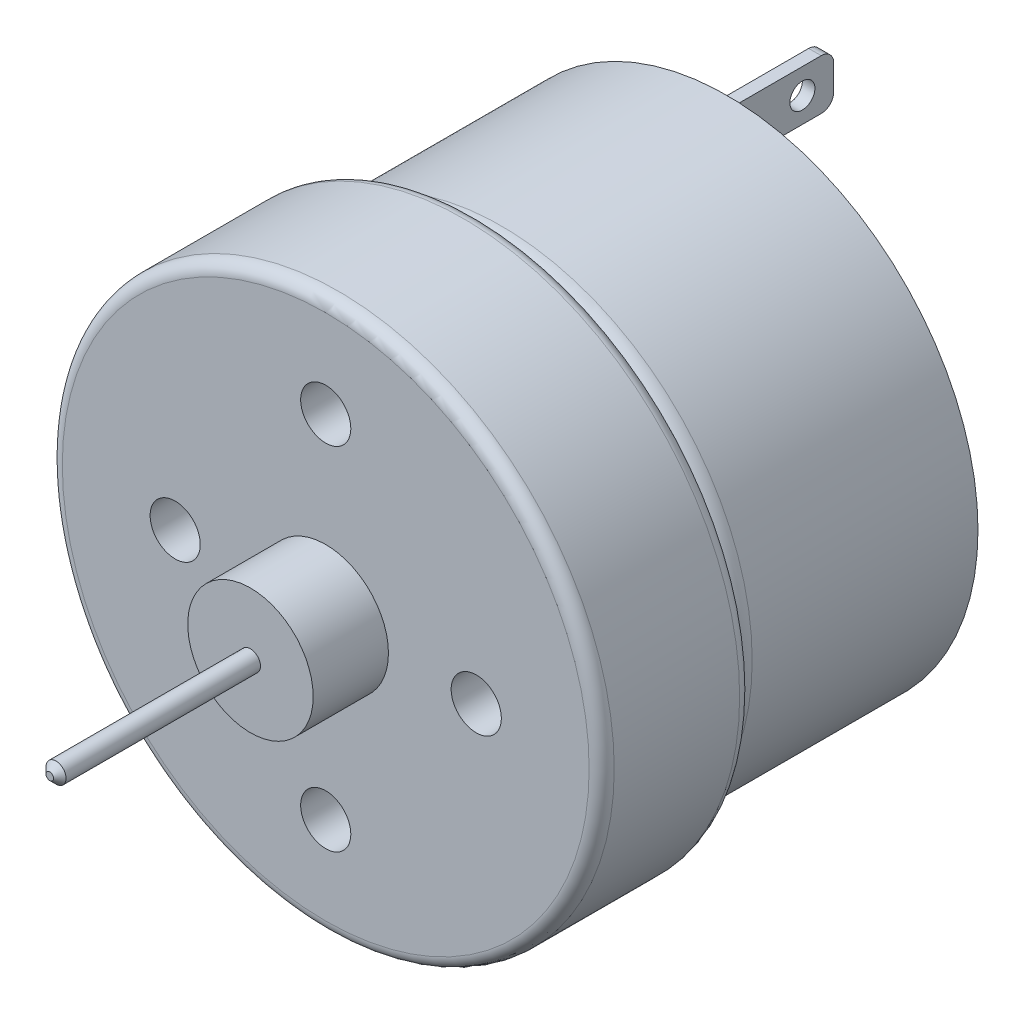
ISO-10303-21;
HEADER;
FILE_DESCRIPTION(('STEP AP214'),'2;1');
FILE_NAME('part.step','',(''),(''),'','','');
FILE_SCHEMA(('AUTOMOTIVE_DESIGN { 1 0 10303 214 1 1 1 1 }'));
ENDSEC;
DATA;
#1=APPLICATION_CONTEXT('core data for automotive mechanical design processes');
#2=APPLICATION_PROTOCOL_DEFINITION('international standard','automotive_design',2000,#1);
#3=PRODUCT_CONTEXT('',#1,'mechanical');
#4=PRODUCT('Part','Part','',(#3));
#5=PRODUCT_RELATED_PRODUCT_CATEGORY('part','',(#4));
#6=PRODUCT_DEFINITION_FORMATION('','',#4);
#7=PRODUCT_DEFINITION_CONTEXT('part definition',#1,'design');
#8=PRODUCT_DEFINITION('design','',#6,#7);
#9=PRODUCT_DEFINITION_SHAPE('','',#8);
#10=(LENGTH_UNIT() NAMED_UNIT(*) SI_UNIT(.MILLI.,.METRE.));
#11=(NAMED_UNIT(*) PLANE_ANGLE_UNIT() SI_UNIT($,.RADIAN.));
#12=(NAMED_UNIT(*) SI_UNIT($,.STERADIAN.) SOLID_ANGLE_UNIT());
#13=UNCERTAINTY_MEASURE_WITH_UNIT(LENGTH_MEASURE(1.E-05),#10,'distance_accuracy_value','');
#14=(GEOMETRIC_REPRESENTATION_CONTEXT(3) GLOBAL_UNCERTAINTY_ASSIGNED_CONTEXT((#13)) GLOBAL_UNIT_ASSIGNED_CONTEXT((#10,
#11,#12)) REPRESENTATION_CONTEXT('',''));
#15=CARTESIAN_POINT('',(0.,0.,0.));
#16=DIRECTION('',(0.,0.,1.));
#17=DIRECTION('',(1.,0.,0.));
#18=AXIS2_PLACEMENT_3D('',#15,#16,#17);
#19=CARTESIAN_POINT('',(0.,0.,0.));
#20=DIRECTION('',(0.,0.,1.));
#21=DIRECTION('',(1.,0.,0.));
#22=AXIS2_PLACEMENT_3D('',#19,#20,#21);
#23=PLANE('',#22);
#24=CARTESIAN_POINT('',(0.,0.,0.));
#25=DIRECTION('',(0.,0.,1.));
#26=DIRECTION('',(1.,0.,0.));
#27=AXIS2_PLACEMENT_3D('',#24,#25,#26);
#28=CIRCLE('',#27,10.);
#29=CARTESIAN_POINT('',(10.,0.,0.));
#30=VERTEX_POINT('',#29);
#31=EDGE_CURVE('E193',#30,#30,#28,.T.);
#32=ORIENTED_EDGE('',*,*,#31,.F.);
#33=EDGE_LOOP('',(#32));
#34=FACE_BOUND('',#33,.T.);
#35=CARTESIAN_POINT('',(0.,0.,0.));
#36=DIRECTION('',(0.,0.,-1.));
#37=DIRECTION('',(-1.,0.,0.));
#38=AXIS2_PLACEMENT_3D('',#35,#36,#37);
#39=CIRCLE('',#38,3.25);
#40=CARTESIAN_POINT('',(-3.25,0.,0.));
#41=VERTEX_POINT('',#40);
#42=EDGE_CURVE('E199',#41,#41,#39,.T.);
#43=ORIENTED_EDGE('',*,*,#42,.F.);
#44=EDGE_LOOP('',(#43));
#45=FACE_BOUND('',#44,.T.);
#46=DIRECTION('',(0.,-1.,0.));
#47=VECTOR('',#46,1.);
#48=CARTESIAN_POINT('',(0.250000000000003,9.75,0.));
#49=LINE('',#48,#47);
#50=CARTESIAN_POINT('',(0.250000000000003,9.75,0.));
#51=VERTEX_POINT('',#50);
#52=CARTESIAN_POINT('',(0.250000000000002,7.75,0.));
#53=VERTEX_POINT('',#52);
#54=EDGE_CURVE('E177',#51,#53,#49,.T.);
#55=ORIENTED_EDGE('',*,*,#54,.F.);
#56=DIRECTION('',(-1.,0.,0.));
#57=VECTOR('',#56,1.);
#58=CARTESIAN_POINT('',(0.250000000000003,9.75,0.));
#59=LINE('',#58,#57);
#60=CARTESIAN_POINT('',(-0.249999999999997,9.75,0.));
#61=VERTEX_POINT('',#60);
#62=EDGE_CURVE('E172',#51,#61,#59,.T.);
#63=ORIENTED_EDGE('',*,*,#62,.T.);
#64=DIRECTION('',(0.,-1.,0.));
#65=VECTOR('',#64,1.);
#66=CARTESIAN_POINT('',(-0.249999999999997,9.75,0.));
#67=LINE('',#66,#65);
#68=CARTESIAN_POINT('',(-0.249999999999998,7.75,0.));
#69=VERTEX_POINT('',#68);
#70=EDGE_CURVE('E183',#61,#69,#67,.T.);
#71=ORIENTED_EDGE('',*,*,#70,.T.);
#72=DIRECTION('',(-1.,0.,0.));
#73=VECTOR('',#72,1.);
#74=CARTESIAN_POINT('',(0.250000000000002,7.75,0.));
#75=LINE('',#74,#73);
#76=EDGE_CURVE('E186',#53,#69,#75,.T.);
#77=ORIENTED_EDGE('',*,*,#76,.F.);
#78=EDGE_LOOP('',(#55,#63,#71,#77));
#79=FACE_BOUND('',#78,.T.);
#80=DIRECTION('',(-1.,0.,0.));
#81=VECTOR('',#80,1.);
#82=CARTESIAN_POINT('',(0.250000000000003,-9.75,0.));
#83=LINE('',#82,#81);
#84=CARTESIAN_POINT('',(0.250000000000003,-9.75,0.));
#85=VERTEX_POINT('',#84);
#86=CARTESIAN_POINT('',(-0.249999999999997,-9.75,0.));
#87=VERTEX_POINT('',#86);
#88=EDGE_CURVE('E132',#85,#87,#83,.T.);
#89=ORIENTED_EDGE('',*,*,#88,.F.);
#90=DIRECTION('',(0.,1.,0.));
#91=VECTOR('',#90,1.);
#92=CARTESIAN_POINT('',(0.250000000000003,-9.75,0.));
#93=LINE('',#92,#91);
#94=CARTESIAN_POINT('',(0.250000000000002,-7.75,0.));
#95=VERTEX_POINT('',#94);
#96=EDGE_CURVE('E140',#85,#95,#93,.T.);
#97=ORIENTED_EDGE('',*,*,#96,.T.);
#98=DIRECTION('',(-1.,0.,0.));
#99=VECTOR('',#98,1.);
#100=CARTESIAN_POINT('',(0.250000000000002,-7.75,0.));
#101=LINE('',#100,#99);
#102=CARTESIAN_POINT('',(-0.249999999999998,-7.75,0.));
#103=VERTEX_POINT('',#102);
#104=EDGE_CURVE('E146',#95,#103,#101,.T.);
#105=ORIENTED_EDGE('',*,*,#104,.T.);
#106=DIRECTION('',(0.,1.,0.));
#107=VECTOR('',#106,1.);
#108=CARTESIAN_POINT('',(-0.249999999999997,-9.75,0.));
#109=LINE('',#108,#107);
#110=EDGE_CURVE('E149',#87,#103,#109,.T.);
#111=ORIENTED_EDGE('',*,*,#110,.F.);
#112=EDGE_LOOP('',(#89,#97,#105,#111));
#113=FACE_BOUND('',#112,.T.);
#114=ADVANCED_FACE('F38',(#34,#45,#79,#113),#23,.F.);
#115=CARTESIAN_POINT('',(0.,0.,10.));
#116=DIRECTION('',(0.,0.,-1.));
#117=DIRECTION('',(-1.,0.,0.));
#118=AXIS2_PLACEMENT_3D('',#115,#116,#117);
#119=CYLINDRICAL_SURFACE('',#118,10.);
#120=CARTESIAN_POINT('',(0.,0.,9.));
#121=DIRECTION('',(0.,0.,1.));
#122=DIRECTION('',(1.,0.,0.));
#123=AXIS2_PLACEMENT_3D('',#120,#121,#122);
#124=CIRCLE('',#123,10.);
#125=CARTESIAN_POINT('',(10.,0.,9.));
#126=VERTEX_POINT('',#125);
#127=EDGE_CURVE('E203',#126,#126,#124,.F.);
#128=ORIENTED_EDGE('',*,*,#127,.T.);
#129=EDGE_LOOP('',(#128));
#130=FACE_BOUND('',#129,.T.);
#131=ORIENTED_EDGE('',*,*,#31,.T.);
#132=EDGE_LOOP('',(#131));
#133=FACE_BOUND('',#132,.T.);
#134=ADVANCED_FACE('F281',(#130,#133),#119,.T.);
#135=CARTESIAN_POINT('',(0.,0.,9.));
#136=DIRECTION('',(0.,0.,1.));
#137=DIRECTION('',(1.,0.,0.));
#138=AXIS2_PLACEMENT_3D('',#135,#136,#137);
#139=TOROIDAL_SURFACE('',#138,9.,1.);
#140=ORIENTED_EDGE('',*,*,#127,.F.);
#141=EDGE_LOOP('',(#140));
#142=FACE_BOUND('',#141,.T.);
#143=CARTESIAN_POINT('',(0.,0.,10.));
#144=DIRECTION('',(0.,0.,1.));
#145=DIRECTION('',(1.,0.,0.));
#146=AXIS2_PLACEMENT_3D('',#143,#144,#145);
#147=CIRCLE('',#146,9.);
#148=CARTESIAN_POINT('',(9.,0.,10.));
#149=VERTEX_POINT('',#148);
#150=EDGE_CURVE('E206',#149,#149,#147,.T.);
#151=ORIENTED_EDGE('',*,*,#150,.F.);
#152=EDGE_LOOP('',(#151));
#153=FACE_BOUND('',#152,.T.);
#154=ADVANCED_FACE('F287',(#142,#153),#139,.T.);
#155=CARTESIAN_POINT('',(0.,0.,-2.));
#156=DIRECTION('',(0.,0.,1.));
#157=DIRECTION('',(1.,0.,0.));
#158=AXIS2_PLACEMENT_3D('',#155,#156,#157);
#159=CYLINDRICAL_SURFACE('',#158,3.25);
#160=CARTESIAN_POINT('',(0.,0.,-1.5));
#161=DIRECTION('',(0.,0.,-1.));
#162=DIRECTION('',(-1.,0.,0.));
#163=AXIS2_PLACEMENT_3D('',#160,#161,#162);
#164=CIRCLE('',#163,3.25);
#165=CARTESIAN_POINT('',(-3.25,0.,-1.5));
#166=VERTEX_POINT('',#165);
#167=EDGE_CURVE('E260',#166,#166,#164,.F.);
#168=ORIENTED_EDGE('',*,*,#167,.T.);
#169=EDGE_LOOP('',(#168));
#170=FACE_BOUND('',#169,.T.);
#171=ORIENTED_EDGE('',*,*,#42,.T.);
#172=EDGE_LOOP('',(#171));
#173=FACE_BOUND('',#172,.T.);
#174=ADVANCED_FACE('F293',(#170,#173),#159,.T.);
#175=CARTESIAN_POINT('',(0.,0.,-2.));
#176=DIRECTION('',(0.,0.,-1.));
#177=DIRECTION('',(-1.,0.,0.));
#178=AXIS2_PLACEMENT_3D('',#175,#176,#177);
#179=PLANE('',#178);
#180=CARTESIAN_POINT('',(0.,0.,-2.));
#181=DIRECTION('',(0.,0.,-1.));
#182=DIRECTION('',(-1.,0.,0.));
#183=AXIS2_PLACEMENT_3D('',#180,#181,#182);
#184=CIRCLE('',#183,2.75);
#185=CARTESIAN_POINT('',(-2.75,0.,-2.));
#186=VERTEX_POINT('',#185);
#187=EDGE_CURVE('E257',#186,#186,#184,.T.);
#188=ORIENTED_EDGE('',*,*,#187,.T.);
#189=EDGE_LOOP('',(#188));
#190=FACE_BOUND('',#189,.T.);
#191=ADVANCED_FACE('F388',(#190),#179,.T.);
#192=CARTESIAN_POINT('',(0.250000000000003,9.75,-4.));
#193=DIRECTION('',(0.,1.,0.));
#194=DIRECTION('',(0.,0.,1.));
#195=AXIS2_PLACEMENT_3D('',#192,#193,#194);
#196=PLANE('',#195);
#197=DIRECTION('',(0.,0.,1.));
#198=VECTOR('',#197,1.);
#199=CARTESIAN_POINT('',(0.250000000000003,9.75,-4.));
#200=LINE('',#199,#198);
#201=CARTESIAN_POINT('',(0.250000000000003,9.75,-3.5));
#202=VERTEX_POINT('',#201);
#203=EDGE_CURVE('E191',#202,#51,#200,.T.);
#204=ORIENTED_EDGE('',*,*,#203,.F.);
#205=DIRECTION('',(-1.,0.,0.));
#206=VECTOR('',#205,1.);
#207=CARTESIAN_POINT('',(-0.249999999999997,9.75,-3.5));
#208=LINE('',#207,#206);
#209=CARTESIAN_POINT('',(-0.249999999999997,9.75,-3.5));
#210=VERTEX_POINT('',#209);
#211=EDGE_CURVE('E225',#202,#210,#208,.T.);
#212=ORIENTED_EDGE('',*,*,#211,.T.);
#213=DIRECTION('',(0.,0.,1.));
#214=VECTOR('',#213,1.);
#215=CARTESIAN_POINT('',(-0.249999999999997,9.75,-4.));
#216=LINE('',#215,#214);
#217=EDGE_CURVE('E180',#210,#61,#216,.T.);
#218=ORIENTED_EDGE('',*,*,#217,.T.);
#219=ORIENTED_EDGE('',*,*,#62,.F.);
#220=EDGE_LOOP('',(#204,#212,#218,#219));
#221=FACE_BOUND('',#220,.T.);
#222=ADVANCED_FACE('F379',(#221),#196,.T.);
#223=CARTESIAN_POINT('',(0.250000000000003,9.75,-4.));
#224=DIRECTION('',(-1.,0.,0.));
#225=DIRECTION('',(0.,-1.,0.));
#226=AXIS2_PLACEMENT_3D('',#223,#224,#225);
#227=PLANE('',#226);
#228=CARTESIAN_POINT('',(0.250000000000002,8.75,-2.75));
#229=DIRECTION('',(-1.,0.,0.));
#230=DIRECTION('',(0.,-1.,0.));
#231=AXIS2_PLACEMENT_3D('',#228,#229,#230);
#232=CIRCLE('',#231,0.5);
#233=CARTESIAN_POINT('',(0.250000000000002,8.25,-2.75));
#234=VERTEX_POINT('',#233);
#235=EDGE_CURVE('E169',#234,#234,#232,.T.);
#236=ORIENTED_EDGE('',*,*,#235,.T.);
#237=EDGE_LOOP('',(#236));
#238=FACE_BOUND('',#237,.T.);
#239=DIRECTION('',(0.,0.,1.));
#240=VECTOR('',#239,1.);
#241=CARTESIAN_POINT('',(0.250000000000002,7.75,-4.));
#242=LINE('',#241,#240);
#243=CARTESIAN_POINT('',(0.250000000000002,7.75,-3.5));
#244=VERTEX_POINT('',#243);
#245=EDGE_CURVE('E194',#244,#53,#242,.T.);
#246=ORIENTED_EDGE('',*,*,#245,.F.);
#247=CARTESIAN_POINT('',(0.250000000000002,8.25,-3.5));
#248=DIRECTION('',(-1.,0.,0.));
#249=DIRECTION('',(0.,-1.,0.));
#250=AXIS2_PLACEMENT_3D('',#247,#248,#249);
#251=CIRCLE('',#250,0.5);
#252=CARTESIAN_POINT('',(0.250000000000002,8.25,-4.));
#253=VERTEX_POINT('',#252);
#254=EDGE_CURVE('E223',#244,#253,#251,.F.);
#255=ORIENTED_EDGE('',*,*,#254,.T.);
#256=DIRECTION('',(0.,-1.,0.));
#257=VECTOR('',#256,1.);
#258=CARTESIAN_POINT('',(0.250000000000003,9.75,-4.));
#259=LINE('',#258,#257);
#260=CARTESIAN_POINT('',(0.250000000000002,9.25,-4.));
#261=VERTEX_POINT('',#260);
#262=EDGE_CURVE('E176',#261,#253,#259,.T.);
#263=ORIENTED_EDGE('',*,*,#262,.F.);
#264=CARTESIAN_POINT('',(0.250000000000002,9.25,-3.5));
#265=DIRECTION('',(-1.,0.,0.));
#266=DIRECTION('',(0.,-1.,0.));
#267=AXIS2_PLACEMENT_3D('',#264,#265,#266);
#268=CIRCLE('',#267,0.5);
#269=EDGE_CURVE('E221',#261,#202,#268,.F.);
#270=ORIENTED_EDGE('',*,*,#269,.T.);
#271=ORIENTED_EDGE('',*,*,#203,.T.);
#272=ORIENTED_EDGE('',*,*,#54,.T.);
#273=EDGE_LOOP('',(#246,#255,#263,#270,#271,#272));
#274=FACE_BOUND('',#273,.T.);
#275=ADVANCED_FACE('F375',(#238,#274),#227,.F.);
#276=CARTESIAN_POINT('',(0.250000000000002,7.75,-4.));
#277=DIRECTION('',(0.,1.,0.));
#278=DIRECTION('',(0.,0.,1.));
#279=AXIS2_PLACEMENT_3D('',#276,#277,#278);
#280=PLANE('',#279);
#281=DIRECTION('',(0.,0.,1.));
#282=VECTOR('',#281,1.);
#283=CARTESIAN_POINT('',(-0.249999999999998,7.75,-4.));
#284=LINE('',#283,#282);
#285=CARTESIAN_POINT('',(-0.249999999999998,7.75,-3.5));
#286=VERTEX_POINT('',#285);
#287=EDGE_CURVE('E196',#286,#69,#284,.T.);
#288=ORIENTED_EDGE('',*,*,#287,.F.);
#289=DIRECTION('',(-1.,0.,0.));
#290=VECTOR('',#289,1.);
#291=CARTESIAN_POINT('',(0.250000000000002,7.75,-3.5));
#292=LINE('',#291,#290);
#293=EDGE_CURVE('E219',#286,#244,#292,.F.);
#294=ORIENTED_EDGE('',*,*,#293,.T.);
#295=ORIENTED_EDGE('',*,*,#245,.T.);
#296=ORIENTED_EDGE('',*,*,#76,.T.);
#297=EDGE_LOOP('',(#288,#294,#295,#296));
#298=FACE_BOUND('',#297,.T.);
#299=ADVANCED_FACE('F378',(#298),#280,.F.);
#300=CARTESIAN_POINT('',(-0.249999999999997,9.75,-4.));
#301=DIRECTION('',(-1.,0.,0.));
#302=DIRECTION('',(0.,-1.,0.));
#303=AXIS2_PLACEMENT_3D('',#300,#301,#302);
#304=PLANE('',#303);
#305=CARTESIAN_POINT('',(-0.249999999999998,8.75,-2.75));
#306=DIRECTION('',(-1.,0.,0.));
#307=DIRECTION('',(0.,-1.,0.));
#308=AXIS2_PLACEMENT_3D('',#305,#306,#307);
#309=CIRCLE('',#308,0.5);
#310=CARTESIAN_POINT('',(-0.249999999999998,8.25,-2.75));
#311=VERTEX_POINT('',#310);
#312=EDGE_CURVE('E163',#311,#311,#309,.T.);
#313=ORIENTED_EDGE('',*,*,#312,.F.);
#314=EDGE_LOOP('',(#313));
#315=FACE_BOUND('',#314,.T.);
#316=DIRECTION('',(0.,-1.,0.));
#317=VECTOR('',#316,1.);
#318=CARTESIAN_POINT('',(-0.249999999999997,9.75,-4.));
#319=LINE('',#318,#317);
#320=CARTESIAN_POINT('',(-0.249999999999998,9.25,-4.));
#321=VERTEX_POINT('',#320);
#322=CARTESIAN_POINT('',(-0.249999999999998,8.25,-4.));
#323=VERTEX_POINT('',#322);
#324=EDGE_CURVE('E173',#321,#323,#319,.T.);
#325=ORIENTED_EDGE('',*,*,#324,.T.);
#326=CARTESIAN_POINT('',(-0.249999999999998,8.25,-3.5));
#327=DIRECTION('',(-1.,0.,0.));
#328=DIRECTION('',(0.,-1.,0.));
#329=AXIS2_PLACEMENT_3D('',#326,#327,#328);
#330=CIRCLE('',#329,0.5);
#331=EDGE_CURVE('E217',#323,#286,#330,.T.);
#332=ORIENTED_EDGE('',*,*,#331,.T.);
#333=ORIENTED_EDGE('',*,*,#287,.T.);
#334=ORIENTED_EDGE('',*,*,#70,.F.);
#335=ORIENTED_EDGE('',*,*,#217,.F.);
#336=CARTESIAN_POINT('',(-0.249999999999998,9.25,-3.5));
#337=DIRECTION('',(-1.,0.,0.));
#338=DIRECTION('',(0.,-1.,0.));
#339=AXIS2_PLACEMENT_3D('',#336,#337,#338);
#340=CIRCLE('',#339,0.5);
#341=EDGE_CURVE('E215',#210,#321,#340,.T.);
#342=ORIENTED_EDGE('',*,*,#341,.T.);
#343=EDGE_LOOP('',(#325,#332,#333,#334,#335,#342));
#344=FACE_BOUND('',#343,.T.);
#345=ADVANCED_FACE('F373',(#315,#344),#304,.T.);
#346=CARTESIAN_POINT('',(0.,0.,-4.));
#347=DIRECTION('',(0.,0.,1.));
#348=DIRECTION('',(1.,0.,0.));
#349=AXIS2_PLACEMENT_3D('',#346,#347,#348);
#350=PLANE('',#349);
#351=ORIENTED_EDGE('',*,*,#262,.T.);
#352=DIRECTION('',(-1.,0.,0.));
#353=VECTOR('',#352,1.);
#354=CARTESIAN_POINT('',(0.,8.25,-4.));
#355=LINE('',#354,#353);
#356=EDGE_CURVE('E212',#253,#323,#355,.T.);
#357=ORIENTED_EDGE('',*,*,#356,.T.);
#358=ORIENTED_EDGE('',*,*,#324,.F.);
#359=DIRECTION('',(-1.,0.,0.));
#360=VECTOR('',#359,1.);
#361=CARTESIAN_POINT('',(0.250000000000003,9.25,-4.));
#362=LINE('',#361,#360);
#363=EDGE_CURVE('E202',#321,#261,#362,.F.);
#364=ORIENTED_EDGE('',*,*,#363,.T.);
#365=EDGE_LOOP('',(#351,#357,#358,#364));
#366=FACE_BOUND('',#365,.T.);
#367=ADVANCED_FACE('F369',(#366),#350,.F.);
#368=CARTESIAN_POINT('',(3.75,8.75,-2.75));
#369=DIRECTION('',(-1.,0.,0.));
#370=DIRECTION('',(0.,-1.,0.));
#371=AXIS2_PLACEMENT_3D('',#368,#369,#370);
#372=CYLINDRICAL_SURFACE('',#371,0.5);
#373=ORIENTED_EDGE('',*,*,#312,.T.);
#374=EDGE_LOOP('',(#373));
#375=FACE_BOUND('',#374,.T.);
#376=ORIENTED_EDGE('',*,*,#235,.F.);
#377=EDGE_LOOP('',(#376));
#378=FACE_BOUND('',#377,.T.);
#379=ADVANCED_FACE('F303',(#375,#378),#372,.F.);
#380=CARTESIAN_POINT('',(0.,8.25,-3.5));
#381=DIRECTION('',(-1.,0.,0.));
#382=DIRECTION('',(0.,0.,1.));
#383=AXIS2_PLACEMENT_3D('',#380,#381,#382);
#384=CYLINDRICAL_SURFACE('',#383,0.5);
#385=ORIENTED_EDGE('',*,*,#254,.F.);
#386=ORIENTED_EDGE('',*,*,#293,.F.);
#387=ORIENTED_EDGE('',*,*,#331,.F.);
#388=ORIENTED_EDGE('',*,*,#356,.F.);
#389=EDGE_LOOP('',(#385,#386,#387,#388));
#390=FACE_BOUND('',#389,.T.);
#391=ADVANCED_FACE('F299',(#390),#384,.T.);
#392=CARTESIAN_POINT('',(0.250000000000003,9.25,-3.5));
#393=DIRECTION('',(1.,0.,0.));
#394=DIRECTION('',(0.,0.,-1.));
#395=AXIS2_PLACEMENT_3D('',#392,#393,#394);
#396=CYLINDRICAL_SURFACE('',#395,0.5);
#397=ORIENTED_EDGE('',*,*,#269,.F.);
#398=ORIENTED_EDGE('',*,*,#363,.F.);
#399=ORIENTED_EDGE('',*,*,#341,.F.);
#400=ORIENTED_EDGE('',*,*,#211,.F.);
#401=EDGE_LOOP('',(#397,#398,#399,#400));
#402=FACE_BOUND('',#401,.T.);
#403=ADVANCED_FACE('F302',(#402),#396,.T.);
#404=CARTESIAN_POINT('',(0.250000000000003,-9.75,-4.));
#405=DIRECTION('',(0.,1.,0.));
#406=DIRECTION('',(0.,0.,1.));
#407=AXIS2_PLACEMENT_3D('',#404,#405,#406);
#408=PLANE('',#407);
#409=DIRECTION('',(0.,0.,1.));
#410=VECTOR('',#409,1.);
#411=CARTESIAN_POINT('',(-0.249999999999997,-9.75,-4.));
#412=LINE('',#411,#410);
#413=CARTESIAN_POINT('',(-0.249999999999997,-9.75,-3.5));
#414=VERTEX_POINT('',#413);
#415=EDGE_CURVE('E161',#414,#87,#412,.T.);
#416=ORIENTED_EDGE('',*,*,#415,.F.);
#417=DIRECTION('',(-1.,0.,0.));
#418=VECTOR('',#417,1.);
#419=CARTESIAN_POINT('',(0.250000000000003,-9.75,-3.5));
#420=LINE('',#419,#418);
#421=CARTESIAN_POINT('',(0.250000000000003,-9.75,-3.5));
#422=VERTEX_POINT('',#421);
#423=EDGE_CURVE('E53',#414,#422,#420,.F.);
#424=ORIENTED_EDGE('',*,*,#423,.T.);
#425=DIRECTION('',(0.,0.,1.));
#426=VECTOR('',#425,1.);
#427=CARTESIAN_POINT('',(0.250000000000003,-9.75,-4.));
#428=LINE('',#427,#426);
#429=EDGE_CURVE('E128',#422,#85,#428,.T.);
#430=ORIENTED_EDGE('',*,*,#429,.T.);
#431=ORIENTED_EDGE('',*,*,#88,.T.);
#432=EDGE_LOOP('',(#416,#424,#430,#431));
#433=FACE_BOUND('',#432,.T.);
#434=ADVANCED_FACE('F130',(#433),#408,.F.);
#435=CARTESIAN_POINT('',(-0.249999999999997,-9.75,-4.));
#436=DIRECTION('',(1.,0.,0.));
#437=DIRECTION('',(0.,1.,0.));
#438=AXIS2_PLACEMENT_3D('',#435,#436,#437);
#439=PLANE('',#438);
#440=CARTESIAN_POINT('',(-0.249999999999998,-8.75,-2.75));
#441=DIRECTION('',(1.,0.,0.));
#442=DIRECTION('',(0.,1.,0.));
#443=AXIS2_PLACEMENT_3D('',#440,#441,#442);
#444=CIRCLE('',#443,0.5);
#445=CARTESIAN_POINT('',(-0.249999999999998,-8.25,-2.75));
#446=VERTEX_POINT('',#445);
#447=EDGE_CURVE('E153',#446,#446,#444,.T.);
#448=ORIENTED_EDGE('',*,*,#447,.T.);
#449=EDGE_LOOP('',(#448));
#450=FACE_BOUND('',#449,.T.);
#451=DIRECTION('',(0.,0.,1.));
#452=VECTOR('',#451,1.);
#453=CARTESIAN_POINT('',(-0.249999999999998,-7.75,-4.));
#454=LINE('',#453,#452);
#455=CARTESIAN_POINT('',(-0.249999999999998,-7.75,-3.5));
#456=VERTEX_POINT('',#455);
#457=EDGE_CURVE('E164',#456,#103,#454,.T.);
#458=ORIENTED_EDGE('',*,*,#457,.F.);
#459=CARTESIAN_POINT('',(-0.249999999999998,-8.25,-3.5));
#460=DIRECTION('',(1.,0.,0.));
#461=DIRECTION('',(0.,1.,0.));
#462=AXIS2_PLACEMENT_3D('',#459,#460,#461);
#463=CIRCLE('',#462,0.5);
#464=CARTESIAN_POINT('',(-0.249999999999998,-8.25,-4.));
#465=VERTEX_POINT('',#464);
#466=EDGE_CURVE('E233',#456,#465,#463,.F.);
#467=ORIENTED_EDGE('',*,*,#466,.T.);
#468=DIRECTION('',(0.,1.,0.));
#469=VECTOR('',#468,1.);
#470=CARTESIAN_POINT('',(-0.249999999999997,-9.75,-4.));
#471=LINE('',#470,#469);
#472=CARTESIAN_POINT('',(-0.249999999999998,-9.25,-4.));
#473=VERTEX_POINT('',#472);
#474=EDGE_CURVE('E137',#473,#465,#471,.T.);
#475=ORIENTED_EDGE('',*,*,#474,.F.);
#476=CARTESIAN_POINT('',(-0.249999999999998,-9.25,-3.5));
#477=DIRECTION('',(1.,0.,0.));
#478=DIRECTION('',(0.,1.,0.));
#479=AXIS2_PLACEMENT_3D('',#476,#477,#478);
#480=CIRCLE('',#479,0.5);
#481=EDGE_CURVE('E231',#473,#414,#480,.F.);
#482=ORIENTED_EDGE('',*,*,#481,.T.);
#483=ORIENTED_EDGE('',*,*,#415,.T.);
#484=ORIENTED_EDGE('',*,*,#110,.T.);
#485=EDGE_LOOP('',(#458,#467,#475,#482,#483,#484));
#486=FACE_BOUND('',#485,.T.);
#487=ADVANCED_FACE('F354',(#450,#486),#439,.F.);
#488=CARTESIAN_POINT('',(0.250000000000002,-7.75,-4.));
#489=DIRECTION('',(0.,1.,0.));
#490=DIRECTION('',(0.,0.,1.));
#491=AXIS2_PLACEMENT_3D('',#488,#489,#490);
#492=PLANE('',#491);
#493=DIRECTION('',(0.,0.,1.));
#494=VECTOR('',#493,1.);
#495=CARTESIAN_POINT('',(0.250000000000002,-7.75,-4.));
#496=LINE('',#495,#494);
#497=CARTESIAN_POINT('',(0.250000000000002,-7.75,-3.5));
#498=VERTEX_POINT('',#497);
#499=EDGE_CURVE('E136',#498,#95,#496,.T.);
#500=ORIENTED_EDGE('',*,*,#499,.F.);
#501=DIRECTION('',(-1.,0.,0.));
#502=VECTOR('',#501,1.);
#503=CARTESIAN_POINT('',(-0.249999999999998,-7.75,-3.5));
#504=LINE('',#503,#502);
#505=EDGE_CURVE('E227',#498,#456,#504,.T.);
#506=ORIENTED_EDGE('',*,*,#505,.T.);
#507=ORIENTED_EDGE('',*,*,#457,.T.);
#508=ORIENTED_EDGE('',*,*,#104,.F.);
#509=EDGE_LOOP('',(#500,#506,#507,#508));
#510=FACE_BOUND('',#509,.T.);
#511=ADVANCED_FACE('F357',(#510),#492,.T.);
#512=CARTESIAN_POINT('',(0.250000000000003,-9.75,-4.));
#513=DIRECTION('',(1.,0.,0.));
#514=DIRECTION('',(0.,1.,0.));
#515=AXIS2_PLACEMENT_3D('',#512,#513,#514);
#516=PLANE('',#515);
#517=CARTESIAN_POINT('',(0.250000000000002,-8.75,-2.75));
#518=DIRECTION('',(1.,0.,0.));
#519=DIRECTION('',(0.,1.,0.));
#520=AXIS2_PLACEMENT_3D('',#517,#518,#519);
#521=CIRCLE('',#520,0.5);
#522=CARTESIAN_POINT('',(0.250000000000002,-8.25,-2.75));
#523=VERTEX_POINT('',#522);
#524=EDGE_CURVE('E150',#523,#523,#521,.F.);
#525=ORIENTED_EDGE('',*,*,#524,.T.);
#526=EDGE_LOOP('',(#525));
#527=FACE_BOUND('',#526,.T.);
#528=DIRECTION('',(0.,1.,0.));
#529=VECTOR('',#528,1.);
#530=CARTESIAN_POINT('',(0.250000000000003,-9.75,-4.));
#531=LINE('',#530,#529);
#532=CARTESIAN_POINT('',(0.250000000000002,-9.25,-4.));
#533=VERTEX_POINT('',#532);
#534=CARTESIAN_POINT('',(0.250000000000002,-8.25,-4.));
#535=VERTEX_POINT('',#534);
#536=EDGE_CURVE('E160',#533,#535,#531,.T.);
#537=ORIENTED_EDGE('',*,*,#536,.T.);
#538=CARTESIAN_POINT('',(0.250000000000002,-8.25,-3.5));
#539=DIRECTION('',(1.,0.,0.));
#540=DIRECTION('',(0.,1.,0.));
#541=AXIS2_PLACEMENT_3D('',#538,#539,#540);
#542=CIRCLE('',#541,0.5);
#543=EDGE_CURVE('E241',#535,#498,#542,.T.);
#544=ORIENTED_EDGE('',*,*,#543,.T.);
#545=ORIENTED_EDGE('',*,*,#499,.T.);
#546=ORIENTED_EDGE('',*,*,#96,.F.);
#547=ORIENTED_EDGE('',*,*,#429,.F.);
#548=CARTESIAN_POINT('',(0.250000000000002,-9.25,-3.5));
#549=DIRECTION('',(1.,0.,0.));
#550=DIRECTION('',(0.,1.,0.));
#551=AXIS2_PLACEMENT_3D('',#548,#549,#550);
#552=CIRCLE('',#551,0.5);
#553=EDGE_CURVE('E239',#422,#533,#552,.T.);
#554=ORIENTED_EDGE('',*,*,#553,.T.);
#555=EDGE_LOOP('',(#537,#544,#545,#546,#547,#554));
#556=FACE_BOUND('',#555,.T.);
#557=ADVANCED_FACE('F141',(#527,#556),#516,.T.);
#558=CARTESIAN_POINT('',(0.,0.,-4.));
#559=DIRECTION('',(0.,0.,1.));
#560=DIRECTION('',(1.,0.,0.));
#561=AXIS2_PLACEMENT_3D('',#558,#559,#560);
#562=PLANE('',#561);
#563=ORIENTED_EDGE('',*,*,#474,.T.);
#564=DIRECTION('',(-1.,0.,0.));
#565=VECTOR('',#564,1.);
#566=CARTESIAN_POINT('',(0.250000000000002,-8.25,-4.));
#567=LINE('',#566,#565);
#568=EDGE_CURVE('E61',#465,#535,#567,.F.);
#569=ORIENTED_EDGE('',*,*,#568,.T.);
#570=ORIENTED_EDGE('',*,*,#536,.F.);
#571=DIRECTION('',(-1.,0.,0.));
#572=VECTOR('',#571,1.);
#573=CARTESIAN_POINT('',(0.,-9.25,-4.));
#574=LINE('',#573,#572);
#575=EDGE_CURVE('E235',#533,#473,#574,.T.);
#576=ORIENTED_EDGE('',*,*,#575,.T.);
#577=EDGE_LOOP('',(#563,#569,#570,#576));
#578=FACE_BOUND('',#577,.T.);
#579=ADVANCED_FACE('F350',(#578),#562,.F.);
#580=CARTESIAN_POINT('',(3.75,-8.75,-2.75));
#581=DIRECTION('',(-1.,0.,0.));
#582=DIRECTION('',(0.,-1.,0.));
#583=AXIS2_PLACEMENT_3D('',#580,#581,#582);
#584=CYLINDRICAL_SURFACE('',#583,0.5);
#585=ORIENTED_EDGE('',*,*,#524,.F.);
#586=EDGE_LOOP('',(#585));
#587=FACE_BOUND('',#586,.T.);
#588=ORIENTED_EDGE('',*,*,#447,.F.);
#589=EDGE_LOOP('',(#588));
#590=FACE_BOUND('',#589,.T.);
#591=ADVANCED_FACE('F312',(#587,#590),#584,.F.);
#592=CARTESIAN_POINT('',(0.250000000000002,-8.25,-3.5));
#593=DIRECTION('',(1.,0.,0.));
#594=DIRECTION('',(0.,0.,-1.));
#595=AXIS2_PLACEMENT_3D('',#592,#593,#594);
#596=CYLINDRICAL_SURFACE('',#595,0.5);
#597=ORIENTED_EDGE('',*,*,#543,.F.);
#598=ORIENTED_EDGE('',*,*,#568,.F.);
#599=ORIENTED_EDGE('',*,*,#466,.F.);
#600=ORIENTED_EDGE('',*,*,#505,.F.);
#601=EDGE_LOOP('',(#597,#598,#599,#600));
#602=FACE_BOUND('',#601,.T.);
#603=ADVANCED_FACE('F308',(#602),#596,.T.);
#604=CARTESIAN_POINT('',(0.,-9.25,-3.5));
#605=DIRECTION('',(-1.,0.,0.));
#606=DIRECTION('',(0.,0.,1.));
#607=AXIS2_PLACEMENT_3D('',#604,#605,#606);
#608=CYLINDRICAL_SURFACE('',#607,0.5);
#609=ORIENTED_EDGE('',*,*,#553,.F.);
#610=ORIENTED_EDGE('',*,*,#423,.F.);
#611=ORIENTED_EDGE('',*,*,#481,.F.);
#612=ORIENTED_EDGE('',*,*,#575,.F.);
#613=EDGE_LOOP('',(#609,#610,#611,#612));
#614=FACE_BOUND('',#613,.T.);
#615=ADVANCED_FACE('F311',(#614),#608,.T.);
#616=CARTESIAN_POINT('',(0.,0.,16.));
#617=DIRECTION('',(0.,0.,-1.));
#618=DIRECTION('',(-1.,0.,0.));
#619=AXIS2_PLACEMENT_3D('',#616,#617,#618);
#620=CYLINDRICAL_SURFACE('',#619,11.);
#621=CARTESIAN_POINT('',(0.,0.,15.5));
#622=DIRECTION('',(0.,0.,1.));
#623=DIRECTION('',(1.,0.,0.));
#624=AXIS2_PLACEMENT_3D('',#621,#622,#623);
#625=CIRCLE('',#624,11.);
#626=CARTESIAN_POINT('',(11.,0.,15.5));
#627=VERTEX_POINT('',#626);
#628=EDGE_CURVE('E250',#627,#627,#625,.F.);
#629=ORIENTED_EDGE('',*,*,#628,.T.);
#630=EDGE_LOOP('',(#629));
#631=FACE_BOUND('',#630,.T.);
#632=CARTESIAN_POINT('',(0.,0.,10.5));
#633=DIRECTION('',(0.,0.,1.));
#634=DIRECTION('',(1.,0.,0.));
#635=AXIS2_PLACEMENT_3D('',#632,#633,#634);
#636=CIRCLE('',#635,11.);
#637=CARTESIAN_POINT('',(11.,0.,10.5));
#638=VERTEX_POINT('',#637);
#639=EDGE_CURVE('E247',#638,#638,#636,.T.);
#640=ORIENTED_EDGE('',*,*,#639,.T.);
#641=EDGE_LOOP('',(#640));
#642=FACE_BOUND('',#641,.T.);
#643=ADVANCED_FACE('F316',(#631,#642),#620,.T.);
#644=CARTESIAN_POINT('',(0.,0.,16.));
#645=DIRECTION('',(0.,0.,1.));
#646=DIRECTION('',(1.,0.,0.));
#647=AXIS2_PLACEMENT_3D('',#644,#645,#646);
#648=PLANE('',#647);
#649=CARTESIAN_POINT('',(0.,7.,16.));
#650=DIRECTION('',(0.,0.,1.));
#651=DIRECTION('',(1.,0.,0.));
#652=AXIS2_PLACEMENT_3D('',#649,#650,#651);
#653=CIRCLE('',#652,1.);
#654=CARTESIAN_POINT('',(1.,7.,16.));
#655=VERTEX_POINT('',#654);
#656=EDGE_CURVE('E696',#655,#655,#653,.T.);
#657=ORIENTED_EDGE('',*,*,#656,.F.);
#658=EDGE_LOOP('',(#657));
#659=FACE_BOUND('',#658,.T.);
#660=CARTESIAN_POINT('',(0.,-7.,16.));
#661=DIRECTION('',(0.,0.,1.));
#662=DIRECTION('',(1.,0.,0.));
#663=AXIS2_PLACEMENT_3D('',#660,#661,#662);
#664=CIRCLE('',#663,1.);
#665=CARTESIAN_POINT('',(1.,-7.,16.));
#666=VERTEX_POINT('',#665);
#667=EDGE_CURVE('E707',#666,#666,#664,.T.);
#668=ORIENTED_EDGE('',*,*,#667,.F.);
#669=EDGE_LOOP('',(#668));
#670=FACE_BOUND('',#669,.T.);
#671=CARTESIAN_POINT('',(6.,0.,16.));
#672=DIRECTION('',(0.,0.,1.));
#673=DIRECTION('',(1.,0.,0.));
#674=AXIS2_PLACEMENT_3D('',#671,#672,#673);
#675=CIRCLE('',#674,1.);
#676=CARTESIAN_POINT('',(7.,0.,16.));
#677=VERTEX_POINT('',#676);
#678=EDGE_CURVE('E713',#677,#677,#675,.T.);
#679=ORIENTED_EDGE('',*,*,#678,.F.);
#680=EDGE_LOOP('',(#679));
#681=FACE_BOUND('',#680,.T.);
#682=CARTESIAN_POINT('',(-6.,0.,16.));
#683=DIRECTION('',(0.,0.,1.));
#684=DIRECTION('',(-1.,0.,0.));
#685=AXIS2_PLACEMENT_3D('',#682,#683,#684);
#686=CIRCLE('',#685,1.);
#687=CARTESIAN_POINT('',(-7.,0.,16.));
#688=VERTEX_POINT('',#687);
#689=EDGE_CURVE('E719',#688,#688,#686,.T.);
#690=ORIENTED_EDGE('',*,*,#689,.F.);
#691=EDGE_LOOP('',(#690));
#692=FACE_BOUND('',#691,.T.);
#693=CARTESIAN_POINT('',(0.,0.,16.));
#694=DIRECTION('',(0.,0.,1.));
#695=DIRECTION('',(1.,0.,0.));
#696=AXIS2_PLACEMENT_3D('',#693,#694,#695);
#697=CIRCLE('',#696,2.5);
#698=CARTESIAN_POINT('',(2.5,0.,16.));
#699=VERTEX_POINT('',#698);
#700=EDGE_CURVE('E695',#699,#699,#697,.T.);
#701=ORIENTED_EDGE('',*,*,#700,.F.);
#702=EDGE_LOOP('',(#701));
#703=FACE_BOUND('',#702,.T.);
#704=CARTESIAN_POINT('',(0.,0.,16.));
#705=DIRECTION('',(0.,0.,1.));
#706=DIRECTION('',(1.,0.,0.));
#707=AXIS2_PLACEMENT_3D('',#704,#705,#706);
#708=CIRCLE('',#707,10.5);
#709=CARTESIAN_POINT('',(10.5,0.,16.));
#710=VERTEX_POINT('',#709);
#711=EDGE_CURVE('E244',#710,#710,#708,.T.);
#712=ORIENTED_EDGE('',*,*,#711,.T.);
#713=EDGE_LOOP('',(#712));
#714=FACE_BOUND('',#713,.T.);
#715=ADVANCED_FACE('F338',(#659,#670,#681,#692,#703,#714),#648,.T.);
#716=CARTESIAN_POINT('',(0.,0.,10.));
#717=DIRECTION('',(0.,0.,1.));
#718=DIRECTION('',(1.,0.,0.));
#719=AXIS2_PLACEMENT_3D('',#716,#717,#718);
#720=PLANE('',#719);
#721=CARTESIAN_POINT('',(0.,0.,10.));
#722=DIRECTION('',(0.,0.,1.));
#723=DIRECTION('',(1.,0.,0.));
#724=AXIS2_PLACEMENT_3D('',#721,#722,#723);
#725=CIRCLE('',#724,10.5);
#726=CARTESIAN_POINT('',(10.5,0.,10.));
#727=VERTEX_POINT('',#726);
#728=EDGE_CURVE('E253',#727,#727,#725,.F.);
#729=ORIENTED_EDGE('',*,*,#728,.T.);
#730=EDGE_LOOP('',(#729));
#731=FACE_BOUND('',#730,.T.);
#732=ORIENTED_EDGE('',*,*,#150,.T.);
#733=EDGE_LOOP('',(#732));
#734=FACE_BOUND('',#733,.T.);
#735=ADVANCED_FACE('F322',(#731,#734),#720,.F.);
#736=CARTESIAN_POINT('',(0.,0.,15.5));
#737=DIRECTION('',(0.,0.,1.));
#738=DIRECTION('',(1.,0.,0.));
#739=AXIS2_PLACEMENT_3D('',#736,#737,#738);
#740=TOROIDAL_SURFACE('',#739,10.5,0.5);
#741=ORIENTED_EDGE('',*,*,#628,.F.);
#742=EDGE_LOOP('',(#741));
#743=FACE_BOUND('',#742,.T.);
#744=ORIENTED_EDGE('',*,*,#711,.F.);
#745=EDGE_LOOP('',(#744));
#746=FACE_BOUND('',#745,.T.);
#747=ADVANCED_FACE('F318',(#743,#746),#740,.T.);
#748=CARTESIAN_POINT('',(0.,0.,10.5));
#749=DIRECTION('',(0.,0.,1.));
#750=DIRECTION('',(1.,0.,0.));
#751=AXIS2_PLACEMENT_3D('',#748,#749,#750);
#752=TOROIDAL_SURFACE('',#751,10.5,0.5);
#753=ORIENTED_EDGE('',*,*,#728,.F.);
#754=EDGE_LOOP('',(#753));
#755=FACE_BOUND('',#754,.T.);
#756=ORIENTED_EDGE('',*,*,#639,.F.);
#757=EDGE_LOOP('',(#756));
#758=FACE_BOUND('',#757,.T.);
#759=ADVANCED_FACE('F321',(#755,#758),#752,.T.);
#760=CARTESIAN_POINT('',(0.,0.,19.));
#761=DIRECTION('',(0.,0.,-1.));
#762=DIRECTION('',(-1.,0.,0.));
#763=AXIS2_PLACEMENT_3D('',#760,#761,#762);
#764=CYLINDRICAL_SURFACE('',#763,2.5);
#765=CARTESIAN_POINT('',(0.,0.,19.));
#766=DIRECTION('',(0.,0.,1.));
#767=DIRECTION('',(1.,0.,0.));
#768=AXIS2_PLACEMENT_3D('',#765,#766,#767);
#769=CIRCLE('',#768,2.5);
#770=CARTESIAN_POINT('',(2.5,0.,19.));
#771=VERTEX_POINT('',#770);
#772=EDGE_CURVE('E699',#771,#771,#769,.T.);
#773=ORIENTED_EDGE('',*,*,#772,.F.);
#774=EDGE_LOOP('',(#773));
#775=FACE_BOUND('',#774,.T.);
#776=ORIENTED_EDGE('',*,*,#700,.T.);
#777=EDGE_LOOP('',(#776));
#778=FACE_BOUND('',#777,.T.);
#779=ADVANCED_FACE('F325',(#775,#778),#764,.T.);
#780=CARTESIAN_POINT('',(0.,0.,19.));
#781=DIRECTION('',(0.,0.,1.));
#782=DIRECTION('',(1.,0.,0.));
#783=AXIS2_PLACEMENT_3D('',#780,#781,#782);
#784=PLANE('',#783);
#785=CARTESIAN_POINT('',(0.,0.,19.));
#786=DIRECTION('',(0.,0.,1.));
#787=DIRECTION('',(1.,0.,0.));
#788=AXIS2_PLACEMENT_3D('',#785,#786,#787);
#789=CIRCLE('',#788,0.4);
#790=CARTESIAN_POINT('',(0.4,0.,19.));
#791=VERTEX_POINT('',#790);
#792=EDGE_CURVE('E256',#791,#791,#789,.T.);
#793=ORIENTED_EDGE('',*,*,#792,.F.);
#794=EDGE_LOOP('',(#793));
#795=FACE_BOUND('',#794,.T.);
#796=ORIENTED_EDGE('',*,*,#772,.T.);
#797=EDGE_LOOP('',(#796));
#798=FACE_BOUND('',#797,.T.);
#799=ADVANCED_FACE('F330',(#795,#798),#784,.T.);
#800=CARTESIAN_POINT('',(0.,0.,27.));
#801=DIRECTION('',(0.,0.,-1.));
#802=DIRECTION('',(-1.,0.,0.));
#803=AXIS2_PLACEMENT_3D('',#800,#801,#802);
#804=CYLINDRICAL_SURFACE('',#803,0.4);
#805=CARTESIAN_POINT('',(0.,0.,26.75));
#806=DIRECTION('',(0.,0.,1.));
#807=DIRECTION('',(1.,0.,0.));
#808=AXIS2_PLACEMENT_3D('',#805,#806,#807);
#809=CIRCLE('',#808,0.4);
#810=CARTESIAN_POINT('',(0.4,0.,26.75));
#811=VERTEX_POINT('',#810);
#812=EDGE_CURVE('E11',#811,#811,#809,.F.);
#813=ORIENTED_EDGE('',*,*,#812,.T.);
#814=EDGE_LOOP('',(#813));
#815=FACE_BOUND('',#814,.T.);
#816=ORIENTED_EDGE('',*,*,#792,.T.);
#817=EDGE_LOOP('',(#816));
#818=FACE_BOUND('',#817,.T.);
#819=ADVANCED_FACE('F580',(#815,#818),#804,.T.);
#820=CARTESIAN_POINT('',(0.,0.,27.));
#821=DIRECTION('',(0.,0.,1.));
#822=DIRECTION('',(1.,0.,0.));
#823=AXIS2_PLACEMENT_3D('',#820,#821,#822);
#824=PLANE('',#823);
#825=CARTESIAN_POINT('',(0.,0.,27.));
#826=DIRECTION('',(0.,0.,1.));
#827=DIRECTION('',(1.,0.,0.));
#828=AXIS2_PLACEMENT_3D('',#825,#826,#827);
#829=CIRCLE('',#828,0.14999999999999);
#830=CARTESIAN_POINT('',(0.14999999999999,0.,27.));
#831=VERTEX_POINT('',#830);
#832=EDGE_CURVE('E46',#831,#831,#829,.T.);
#833=ORIENTED_EDGE('',*,*,#832,.T.);
#834=EDGE_LOOP('',(#833));
#835=FACE_BOUND('',#834,.T.);
#836=ADVANCED_FACE('F265',(#835),#824,.T.);
#837=CARTESIAN_POINT('',(0.,0.,-2.));
#838=DIRECTION('',(0.,0.,1.));
#839=DIRECTION('',(1.,0.,0.));
#840=AXIS2_PLACEMENT_3D('',#837,#838,#839);
#841=CONICAL_SURFACE('',#840,2.75,0.785398163397451);
#842=ORIENTED_EDGE('',*,*,#167,.F.);
#843=EDGE_LOOP('',(#842));
#844=FACE_BOUND('',#843,.T.);
#845=ORIENTED_EDGE('',*,*,#187,.F.);
#846=EDGE_LOOP('',(#845));
#847=FACE_BOUND('',#846,.T.);
#848=ADVANCED_FACE('F269',(#844,#847),#841,.T.);
#849=CARTESIAN_POINT('',(0.,0.,27.));
#850=DIRECTION('',(0.,0.,-1.));
#851=DIRECTION('',(-1.,0.,0.));
#852=AXIS2_PLACEMENT_3D('',#849,#850,#851);
#853=CONICAL_SURFACE('',#852,0.14999999999999,0.78539816339746);
#854=ORIENTED_EDGE('',*,*,#812,.F.);
#855=EDGE_LOOP('',(#854));
#856=FACE_BOUND('',#855,.T.);
#857=ORIENTED_EDGE('',*,*,#832,.F.);
#858=EDGE_LOOP('',(#857));
#859=FACE_BOUND('',#858,.T.);
#860=ADVANCED_FACE('F40',(#856,#859),#853,.T.);
#861=CARTESIAN_POINT('',(-6.,0.,8.));
#862=DIRECTION('',(0.,0.,1.));
#863=DIRECTION('',(1.,0.,0.));
#864=AXIS2_PLACEMENT_3D('',#861,#862,#863);
#865=CYLINDRICAL_SURFACE('',#864,1.);
#866=CARTESIAN_POINT('',(-6.,0.,8.));
#867=DIRECTION('',(0.,0.,1.));
#868=DIRECTION('',(-1.,0.,0.));
#869=AXIS2_PLACEMENT_3D('',#866,#867,#868);
#870=CIRCLE('',#869,1.);
#871=CARTESIAN_POINT('',(-7.,0.,8.));
#872=VERTEX_POINT('',#871);
#873=EDGE_CURVE('E716',#872,#872,#870,.T.);
#874=ORIENTED_EDGE('',*,*,#873,.F.);
#875=EDGE_LOOP('',(#874));
#876=FACE_BOUND('',#875,.T.);
#877=ORIENTED_EDGE('',*,*,#689,.T.);
#878=EDGE_LOOP('',(#877));
#879=FACE_BOUND('',#878,.T.);
#880=ADVANCED_FACE('F268',(#876,#879),#865,.F.);
#881=CARTESIAN_POINT('',(-6.,0.,8.));
#882=DIRECTION('',(0.,0.,-1.));
#883=DIRECTION('',(-1.,0.,0.));
#884=AXIS2_PLACEMENT_3D('',#881,#882,#883);
#885=PLANE('',#884);
#886=ORIENTED_EDGE('',*,*,#873,.T.);
#887=EDGE_LOOP('',(#886));
#888=FACE_BOUND('',#887,.T.);
#889=ADVANCED_FACE('F275',(#888),#885,.F.);
#890=CARTESIAN_POINT('',(6.,0.,8.));
#891=DIRECTION('',(0.,0.,1.));
#892=DIRECTION('',(1.,0.,0.));
#893=AXIS2_PLACEMENT_3D('',#890,#891,#892);
#894=CYLINDRICAL_SURFACE('',#893,1.);
#895=CARTESIAN_POINT('',(6.,0.,8.));
#896=DIRECTION('',(0.,0.,1.));
#897=DIRECTION('',(1.,0.,0.));
#898=AXIS2_PLACEMENT_3D('',#895,#896,#897);
#899=CIRCLE('',#898,1.);
#900=CARTESIAN_POINT('',(7.,0.,8.));
#901=VERTEX_POINT('',#900);
#902=EDGE_CURVE('E710',#901,#901,#899,.T.);
#903=ORIENTED_EDGE('',*,*,#902,.F.);
#904=EDGE_LOOP('',(#903));
#905=FACE_BOUND('',#904,.T.);
#906=ORIENTED_EDGE('',*,*,#678,.T.);
#907=EDGE_LOOP('',(#906));
#908=FACE_BOUND('',#907,.T.);
#909=ADVANCED_FACE('F628',(#905,#908),#894,.F.);
#910=CARTESIAN_POINT('',(6.,0.,8.));
#911=DIRECTION('',(0.,0.,1.));
#912=DIRECTION('',(1.,0.,0.));
#913=AXIS2_PLACEMENT_3D('',#910,#911,#912);
#914=PLANE('',#913);
#915=ORIENTED_EDGE('',*,*,#902,.T.);
#916=EDGE_LOOP('',(#915));
#917=FACE_BOUND('',#916,.T.);
#918=ADVANCED_FACE('F637',(#917),#914,.T.);
#919=CARTESIAN_POINT('',(0.,-7.,8.));
#920=DIRECTION('',(0.,0.,1.));
#921=DIRECTION('',(1.,0.,0.));
#922=AXIS2_PLACEMENT_3D('',#919,#920,#921);
#923=CYLINDRICAL_SURFACE('',#922,1.);
#924=CARTESIAN_POINT('',(0.,-7.,8.));
#925=DIRECTION('',(0.,0.,1.));
#926=DIRECTION('',(1.,0.,0.));
#927=AXIS2_PLACEMENT_3D('',#924,#925,#926);
#928=CIRCLE('',#927,1.);
#929=CARTESIAN_POINT('',(1.,-7.,8.));
#930=VERTEX_POINT('',#929);
#931=EDGE_CURVE('E702',#930,#930,#928,.T.);
#932=ORIENTED_EDGE('',*,*,#931,.F.);
#933=EDGE_LOOP('',(#932));
#934=FACE_BOUND('',#933,.T.);
#935=ORIENTED_EDGE('',*,*,#667,.T.);
#936=EDGE_LOOP('',(#935));
#937=FACE_BOUND('',#936,.T.);
#938=ADVANCED_FACE('F646',(#934,#937),#923,.F.);
#939=CARTESIAN_POINT('',(0.,-7.,8.));
#940=DIRECTION('',(0.,0.,1.));
#941=DIRECTION('',(1.,0.,0.));
#942=AXIS2_PLACEMENT_3D('',#939,#940,#941);
#943=PLANE('',#942);
#944=ORIENTED_EDGE('',*,*,#931,.T.);
#945=EDGE_LOOP('',(#944));
#946=FACE_BOUND('',#945,.T.);
#947=ADVANCED_FACE('F655',(#946),#943,.T.);
#948=CARTESIAN_POINT('',(0.,7.,8.));
#949=DIRECTION('',(0.,0.,1.));
#950=DIRECTION('',(1.,0.,0.));
#951=AXIS2_PLACEMENT_3D('',#948,#949,#950);
#952=CYLINDRICAL_SURFACE('',#951,1.);
#953=CARTESIAN_POINT('',(0.,7.,8.));
#954=DIRECTION('',(0.,0.,1.));
#955=DIRECTION('',(1.,0.,0.));
#956=AXIS2_PLACEMENT_3D('',#953,#954,#955);
#957=CIRCLE('',#956,1.);
#958=CARTESIAN_POINT('',(1.,7.,8.));
#959=VERTEX_POINT('',#958);
#960=EDGE_CURVE('E694',#959,#959,#957,.T.);
#961=ORIENTED_EDGE('',*,*,#960,.F.);
#962=EDGE_LOOP('',(#961));
#963=FACE_BOUND('',#962,.T.);
#964=ORIENTED_EDGE('',*,*,#656,.T.);
#965=EDGE_LOOP('',(#964));
#966=FACE_BOUND('',#965,.T.);
#967=ADVANCED_FACE('F664',(#963,#966),#952,.F.);
#968=CARTESIAN_POINT('',(0.,7.,8.));
#969=DIRECTION('',(0.,0.,1.));
#970=DIRECTION('',(1.,0.,0.));
#971=AXIS2_PLACEMENT_3D('',#968,#969,#970);
#972=PLANE('',#971);
#973=ORIENTED_EDGE('',*,*,#960,.T.);
#974=EDGE_LOOP('',(#973));
#975=FACE_BOUND('',#974,.T.);
#976=ADVANCED_FACE('F673',(#975),#972,.T.);
#977=CLOSED_SHELL('',(#114,#134,#154,#174,#191,#222,#275,#299,#345,#367,#379,#391,#403,#434,
#487,#511,#557,#579,#591,#603,#615,#643,#715,#735,#747,#759,#779,#799,#819,#836,#848,#860,#880,
#889,#909,#918,#938,#947,#967,#976));
#978=MANIFOLD_SOLID_BREP('B2',#977);
#979=ADVANCED_BREP_SHAPE_REPRESENTATION('',(#18,#978),#14);
#980=SHAPE_DEFINITION_REPRESENTATION(#9,#979);
ENDSEC;
END-ISO-10303-21;
